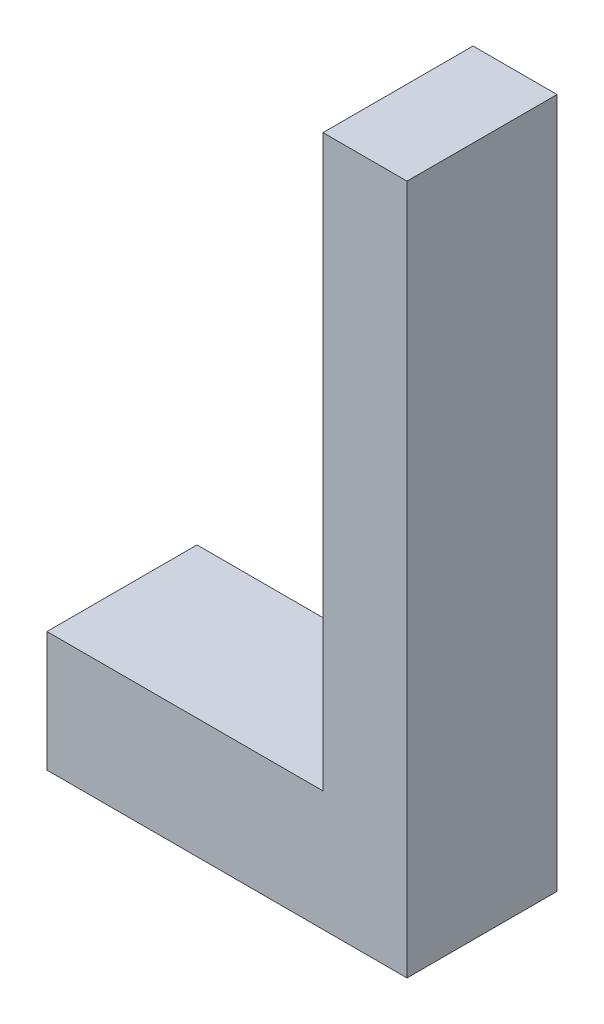
ISO-10303-21;
HEADER;
FILE_DESCRIPTION(('STEP AP214'),'2;1');
FILE_NAME('part.step','',(''),(''),'','','');
FILE_SCHEMA(('AUTOMOTIVE_DESIGN { 1 0 10303 214 1 1 1 1 }'));
ENDSEC;
DATA;
#1=APPLICATION_CONTEXT('core data for automotive mechanical design processes');
#2=APPLICATION_PROTOCOL_DEFINITION('international standard','automotive_design',2000,#1);
#3=PRODUCT_CONTEXT('',#1,'mechanical');
#4=PRODUCT('Part','Part','',(#3));
#5=PRODUCT_RELATED_PRODUCT_CATEGORY('part','',(#4));
#6=PRODUCT_DEFINITION_FORMATION('','',#4);
#7=PRODUCT_DEFINITION_CONTEXT('part definition',#1,'design');
#8=PRODUCT_DEFINITION('design','',#6,#7);
#9=PRODUCT_DEFINITION_SHAPE('','',#8);
#10=(LENGTH_UNIT() NAMED_UNIT(*) SI_UNIT(.MILLI.,.METRE.));
#11=(NAMED_UNIT(*) PLANE_ANGLE_UNIT() SI_UNIT($,.RADIAN.));
#12=(NAMED_UNIT(*) SI_UNIT($,.STERADIAN.) SOLID_ANGLE_UNIT());
#13=UNCERTAINTY_MEASURE_WITH_UNIT(LENGTH_MEASURE(1.E-05),#10,'distance_accuracy_value','');
#14=(GEOMETRIC_REPRESENTATION_CONTEXT(3) GLOBAL_UNCERTAINTY_ASSIGNED_CONTEXT((#13)) GLOBAL_UNIT_ASSIGNED_CONTEXT((#10,
#11,#12)) REPRESENTATION_CONTEXT('',''));
#15=CARTESIAN_POINT('',(0.,0.,0.));
#16=DIRECTION('',(0.,0.,1.));
#17=DIRECTION('',(1.,0.,0.));
#18=AXIS2_PLACEMENT_3D('',#15,#16,#17);
#19=CARTESIAN_POINT('',(0.,1.,1.25));
#20=DIRECTION('',(0.,-1.,0.));
#21=DIRECTION('',(0.,0.,-1.));
#22=AXIS2_PLACEMENT_3D('',#19,#20,#21);
#23=PLANE('',#22);
#24=DIRECTION('',(0.,0.,1.));
#25=VECTOR('',#24,1.);
#26=CARTESIAN_POINT('',(2.29983767716829,1.,-4.80132557512113));
#27=LINE('',#26,#25);
#28=CARTESIAN_POINT('',(2.29983767716829,1.,0.));
#29=VERTEX_POINT('',#28);
#30=CARTESIAN_POINT('',(2.29983767716829,1.,1.25));
#31=VERTEX_POINT('',#30);
#32=EDGE_CURVE('E56',#29,#31,#27,.T.);
#33=ORIENTED_EDGE('',*,*,#32,.F.);
#34=DIRECTION('',(-1.,0.,0.));
#35=VECTOR('',#34,1.);
#36=CARTESIAN_POINT('',(0.,1.,0.));
#37=LINE('',#36,#35);
#38=CARTESIAN_POINT('',(0.,1.,0.));
#39=VERTEX_POINT('',#38);
#40=EDGE_CURVE('E140',#29,#39,#37,.T.);
#41=ORIENTED_EDGE('',*,*,#40,.T.);
#42=DIRECTION('',(0.,0.,-1.));
#43=VECTOR('',#42,1.);
#44=CARTESIAN_POINT('',(0.,1.,1.25));
#45=LINE('',#44,#43);
#46=CARTESIAN_POINT('',(0.,1.,1.25));
#47=VERTEX_POINT('',#46);
#48=EDGE_CURVE('E49',#47,#39,#45,.T.);
#49=ORIENTED_EDGE('',*,*,#48,.F.);
#50=DIRECTION('',(-1.,0.,0.));
#51=VECTOR('',#50,1.);
#52=CARTESIAN_POINT('',(0.,1.,1.25));
#53=LINE('',#52,#51);
#54=EDGE_CURVE('E132',#31,#47,#53,.T.);
#55=ORIENTED_EDGE('',*,*,#54,.F.);
#56=EDGE_LOOP('',(#33,#41,#49,#55));
#57=FACE_BOUND('',#56,.T.);
#58=ADVANCED_FACE('F41',(#57),#23,.F.);
#59=CARTESIAN_POINT('',(0.,0.,1.25));
#60=DIRECTION('',(0.,1.,0.));
#61=DIRECTION('',(0.,0.,1.));
#62=AXIS2_PLACEMENT_3D('',#59,#60,#61);
#63=PLANE('',#62);
#64=DIRECTION('',(1.,0.,0.));
#65=VECTOR('',#64,1.);
#66=CARTESIAN_POINT('',(0.,0.,0.));
#67=LINE('',#66,#65);
#68=CARTESIAN_POINT('',(0.,0.,0.));
#69=VERTEX_POINT('',#68);
#70=CARTESIAN_POINT('',(3.,0.,0.));
#71=VERTEX_POINT('',#70);
#72=EDGE_CURVE('E128',#69,#71,#67,.T.);
#73=ORIENTED_EDGE('',*,*,#72,.T.);
#74=DIRECTION('',(0.,0.,-1.));
#75=VECTOR('',#74,1.);
#76=CARTESIAN_POINT('',(3.,0.,1.25));
#77=LINE('',#76,#75);
#78=CARTESIAN_POINT('',(3.,0.,1.25));
#79=VERTEX_POINT('',#78);
#80=EDGE_CURVE('E11',#79,#71,#77,.T.);
#81=ORIENTED_EDGE('',*,*,#80,.F.);
#82=DIRECTION('',(1.,0.,0.));
#83=VECTOR('',#82,1.);
#84=CARTESIAN_POINT('',(0.,0.,1.25));
#85=LINE('',#84,#83);
#86=CARTESIAN_POINT('',(0.,0.,1.25));
#87=VERTEX_POINT('',#86);
#88=EDGE_CURVE('E129',#87,#79,#85,.T.);
#89=ORIENTED_EDGE('',*,*,#88,.F.);
#90=DIRECTION('',(0.,0.,-1.));
#91=VECTOR('',#90,1.);
#92=CARTESIAN_POINT('',(0.,0.,1.25));
#93=LINE('',#92,#91);
#94=EDGE_CURVE('E135',#87,#69,#93,.T.);
#95=ORIENTED_EDGE('',*,*,#94,.T.);
#96=EDGE_LOOP('',(#73,#81,#89,#95));
#97=FACE_BOUND('',#96,.T.);
#98=ADVANCED_FACE('F43',(#97),#63,.F.);
#99=CARTESIAN_POINT('',(3.,0.,1.25));
#100=DIRECTION('',(-1.,0.,0.));
#101=DIRECTION('',(0.,0.,1.));
#102=AXIS2_PLACEMENT_3D('',#99,#100,#101);
#103=PLANE('',#102);
#104=DIRECTION('',(0.,1.,0.));
#105=VECTOR('',#104,1.);
#106=CARTESIAN_POINT('',(3.,0.,0.));
#107=LINE('',#106,#105);
#108=CARTESIAN_POINT('',(3.,5.74999999999991,0.));
#109=VERTEX_POINT('',#108);
#110=EDGE_CURVE('E138',#71,#109,#107,.T.);
#111=ORIENTED_EDGE('',*,*,#110,.T.);
#112=DIRECTION('',(0.,0.,1.));
#113=VECTOR('',#112,1.);
#114=CARTESIAN_POINT('',(3.,5.74999999999991,-4.80132557512113));
#115=LINE('',#114,#113);
#116=CARTESIAN_POINT('',(3.,5.74999999999991,1.25));
#117=VERTEX_POINT('',#116);
#118=EDGE_CURVE('E123',#109,#117,#115,.T.);
#119=ORIENTED_EDGE('',*,*,#118,.T.);
#120=DIRECTION('',(0.,1.,0.));
#121=VECTOR('',#120,1.);
#122=CARTESIAN_POINT('',(3.,0.,1.25));
#123=LINE('',#122,#121);
#124=EDGE_CURVE('E87',#79,#117,#123,.T.);
#125=ORIENTED_EDGE('',*,*,#124,.F.);
#126=ORIENTED_EDGE('',*,*,#80,.T.);
#127=EDGE_LOOP('',(#111,#119,#125,#126));
#128=FACE_BOUND('',#127,.T.);
#129=ADVANCED_FACE('F151',(#128),#103,.F.);
#130=CARTESIAN_POINT('',(0.,0.,1.25));
#131=DIRECTION('',(1.,0.,0.));
#132=DIRECTION('',(0.,0.,-1.));
#133=AXIS2_PLACEMENT_3D('',#130,#131,#132);
#134=PLANE('',#133);
#135=DIRECTION('',(0.,-1.,0.));
#136=VECTOR('',#135,1.);
#137=CARTESIAN_POINT('',(0.,0.,0.));
#138=LINE('',#137,#136);
#139=EDGE_CURVE('E81',#39,#69,#138,.T.);
#140=ORIENTED_EDGE('',*,*,#139,.T.);
#141=ORIENTED_EDGE('',*,*,#94,.F.);
#142=DIRECTION('',(0.,-1.,0.));
#143=VECTOR('',#142,1.);
#144=CARTESIAN_POINT('',(0.,0.,1.25));
#145=LINE('',#144,#143);
#146=EDGE_CURVE('E65',#47,#87,#145,.T.);
#147=ORIENTED_EDGE('',*,*,#146,.F.);
#148=ORIENTED_EDGE('',*,*,#48,.T.);
#149=EDGE_LOOP('',(#140,#141,#147,#148));
#150=FACE_BOUND('',#149,.T.);
#151=ADVANCED_FACE('F144',(#150),#134,.F.);
#152=CARTESIAN_POINT('',(0.,0.,1.25));
#153=DIRECTION('',(0.,0.,1.));
#154=DIRECTION('',(1.,0.,0.));
#155=AXIS2_PLACEMENT_3D('',#152,#153,#154);
#156=PLANE('',#155);
#157=ORIENTED_EDGE('',*,*,#88,.T.);
#158=ORIENTED_EDGE('',*,*,#124,.T.);
#159=DIRECTION('',(-1.,0.,0.));
#160=VECTOR('',#159,1.);
#161=CARTESIAN_POINT('',(0.,5.74999999999991,1.25));
#162=LINE('',#161,#160);
#163=CARTESIAN_POINT('',(2.29983767716829,5.74999999999991,1.25));
#164=VERTEX_POINT('',#163);
#165=EDGE_CURVE('E109',#117,#164,#162,.T.);
#166=ORIENTED_EDGE('',*,*,#165,.T.);
#167=DIRECTION('',(0.,-1.,0.));
#168=VECTOR('',#167,1.);
#169=CARTESIAN_POINT('',(2.29983767716829,0.,1.25));
#170=LINE('',#169,#168);
#171=EDGE_CURVE('E114',#164,#31,#170,.T.);
#172=ORIENTED_EDGE('',*,*,#171,.T.);
#173=ORIENTED_EDGE('',*,*,#54,.T.);
#174=ORIENTED_EDGE('',*,*,#146,.T.);
#175=EDGE_LOOP('',(#157,#158,#166,#172,#173,#174));
#176=FACE_BOUND('',#175,.T.);
#177=ADVANCED_FACE('F119',(#176),#156,.T.);
#178=CARTESIAN_POINT('',(0.,0.,0.));
#179=DIRECTION('',(0.,0.,1.));
#180=DIRECTION('',(1.,0.,0.));
#181=AXIS2_PLACEMENT_3D('',#178,#179,#180);
#182=PLANE('',#181);
#183=ORIENTED_EDGE('',*,*,#72,.F.);
#184=ORIENTED_EDGE('',*,*,#139,.F.);
#185=ORIENTED_EDGE('',*,*,#40,.F.);
#186=DIRECTION('',(0.,1.,0.));
#187=VECTOR('',#186,1.);
#188=CARTESIAN_POINT('',(2.29983767716829,0.,0.));
#189=LINE('',#188,#187);
#190=CARTESIAN_POINT('',(2.29983767716829,5.74999999999991,0.));
#191=VERTEX_POINT('',#190);
#192=EDGE_CURVE('E126',#29,#191,#189,.T.);
#193=ORIENTED_EDGE('',*,*,#192,.T.);
#194=DIRECTION('',(1.,0.,0.));
#195=VECTOR('',#194,1.);
#196=CARTESIAN_POINT('',(0.,5.74999999999991,0.));
#197=LINE('',#196,#195);
#198=EDGE_CURVE('E111',#191,#109,#197,.T.);
#199=ORIENTED_EDGE('',*,*,#198,.T.);
#200=ORIENTED_EDGE('',*,*,#110,.F.);
#201=EDGE_LOOP('',(#183,#184,#185,#193,#199,#200));
#202=FACE_BOUND('',#201,.T.);
#203=ADVANCED_FACE('F147',(#202),#182,.F.);
#204=CARTESIAN_POINT('',(0.,5.74999999999991,-4.80132557512113));
#205=DIRECTION('',(0.,1.,0.));
#206=DIRECTION('',(-1.,0.,0.));
#207=AXIS2_PLACEMENT_3D('',#204,#205,#206);
#208=PLANE('',#207);
#209=ORIENTED_EDGE('',*,*,#198,.F.);
#210=DIRECTION('',(0.,0.,1.));
#211=VECTOR('',#210,1.);
#212=CARTESIAN_POINT('',(2.29983767716829,5.74999999999991,-4.80132557512113));
#213=LINE('',#212,#211);
#214=EDGE_CURVE('E104',#191,#164,#213,.T.);
#215=ORIENTED_EDGE('',*,*,#214,.T.);
#216=ORIENTED_EDGE('',*,*,#165,.F.);
#217=ORIENTED_EDGE('',*,*,#118,.F.);
#218=EDGE_LOOP('',(#209,#215,#216,#217));
#219=FACE_BOUND('',#218,.T.);
#220=ADVANCED_FACE('F106',(#219),#208,.T.);
#221=CARTESIAN_POINT('',(2.29983767716829,0.,-4.80132557512113));
#222=DIRECTION('',(-1.,0.,0.));
#223=DIRECTION('',(0.,0.,1.));
#224=AXIS2_PLACEMENT_3D('',#221,#222,#223);
#225=PLANE('',#224);
#226=ORIENTED_EDGE('',*,*,#192,.F.);
#227=ORIENTED_EDGE('',*,*,#32,.T.);
#228=ORIENTED_EDGE('',*,*,#171,.F.);
#229=ORIENTED_EDGE('',*,*,#214,.F.);
#230=EDGE_LOOP('',(#226,#227,#228,#229));
#231=FACE_BOUND('',#230,.T.);
#232=ADVANCED_FACE('F117',(#231),#225,.T.);
#233=CLOSED_SHELL('',(#58,#98,#129,#151,#177,#203,#220,#232));
#234=MANIFOLD_SOLID_BREP('B2',#233);
#235=ADVANCED_BREP_SHAPE_REPRESENTATION('',(#18,#234),#14);
#236=SHAPE_DEFINITION_REPRESENTATION(#9,#235);
ENDSEC;
END-ISO-10303-21;
